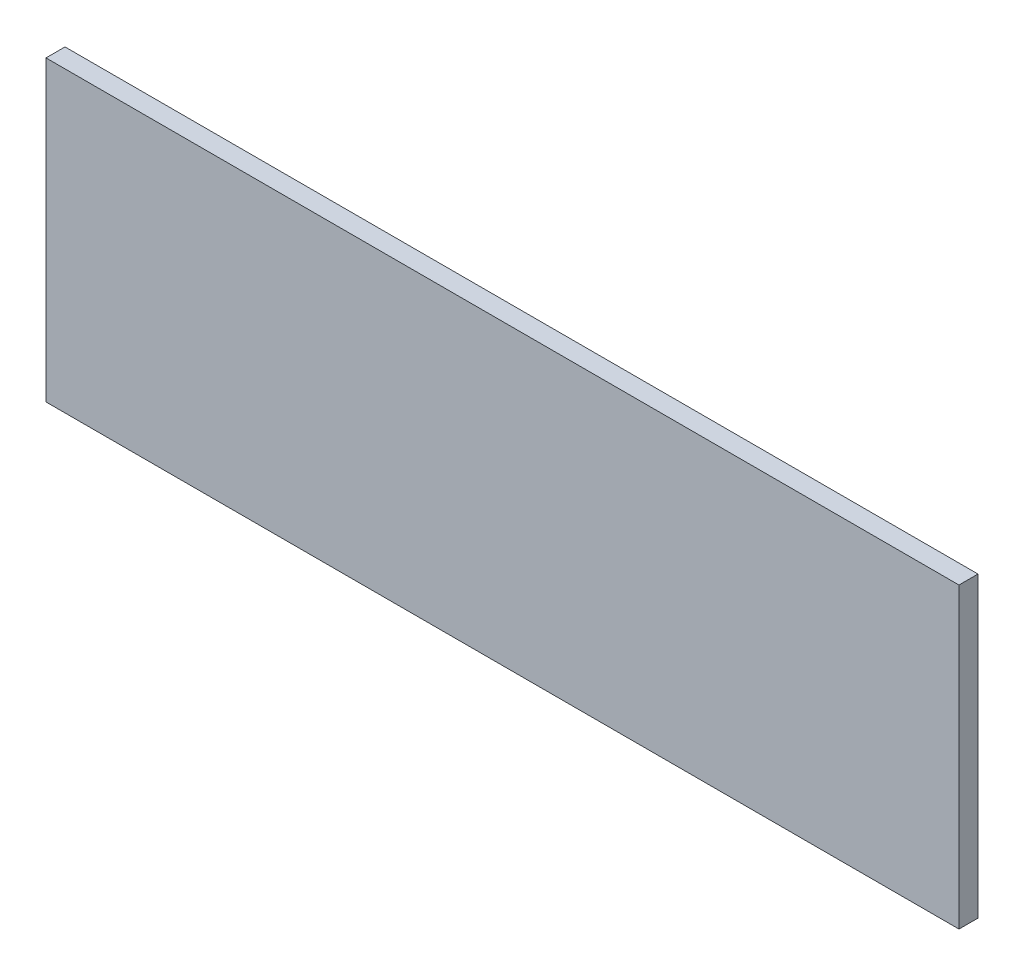
ISO-10303-21;
HEADER;
FILE_DESCRIPTION(('STEP AP214'),'2;1');
FILE_NAME('part.step','',(''),(''),'','','');
FILE_SCHEMA(('AUTOMOTIVE_DESIGN { 1 0 10303 214 1 1 1 1 }'));
ENDSEC;
DATA;
#1=APPLICATION_CONTEXT('core data for automotive mechanical design processes');
#2=APPLICATION_PROTOCOL_DEFINITION('international standard','automotive_design',2000,#1);
#3=PRODUCT_CONTEXT('',#1,'mechanical');
#4=PRODUCT('Part','Part','',(#3));
#5=PRODUCT_RELATED_PRODUCT_CATEGORY('part','',(#4));
#6=PRODUCT_DEFINITION_FORMATION('','',#4);
#7=PRODUCT_DEFINITION_CONTEXT('part definition',#1,'design');
#8=PRODUCT_DEFINITION('design','',#6,#7);
#9=PRODUCT_DEFINITION_SHAPE('','',#8);
#10=(LENGTH_UNIT() NAMED_UNIT(*) SI_UNIT(.MILLI.,.METRE.));
#11=(NAMED_UNIT(*) PLANE_ANGLE_UNIT() SI_UNIT($,.RADIAN.));
#12=(NAMED_UNIT(*) SI_UNIT($,.STERADIAN.) SOLID_ANGLE_UNIT());
#13=UNCERTAINTY_MEASURE_WITH_UNIT(LENGTH_MEASURE(1.E-05),#10,'distance_accuracy_value','');
#14=(GEOMETRIC_REPRESENTATION_CONTEXT(3) GLOBAL_UNCERTAINTY_ASSIGNED_CONTEXT((#13)) GLOBAL_UNIT_ASSIGNED_CONTEXT((#10,
#11,#12)) REPRESENTATION_CONTEXT('',''));
#15=CARTESIAN_POINT('',(0.,0.,0.));
#16=DIRECTION('',(0.,0.,1.));
#17=DIRECTION('',(1.,0.,0.));
#18=AXIS2_PLACEMENT_3D('',#15,#16,#17);
#19=CARTESIAN_POINT('',(159.64431366117,196.181377025538,3.));
#20=DIRECTION('',(0.,-1.,0.));
#21=DIRECTION('',(1.,0.,0.));
#22=AXIS2_PLACEMENT_3D('',#19,#20,#21);
#23=PLANE('',#22);
#24=DIRECTION('',(-1.,0.,0.));
#25=VECTOR('',#24,1.);
#26=CARTESIAN_POINT('',(159.64431366117,196.181377025538,0.));
#27=LINE('',#26,#25);
#28=CARTESIAN_POINT('',(159.64431366117,196.181377025538,0.));
#29=VERTEX_POINT('',#28);
#30=CARTESIAN_POINT('',(15.6443136611697,196.181377025538,0.));
#31=VERTEX_POINT('',#30);
#32=EDGE_CURVE('E97',#29,#31,#27,.T.);
#33=ORIENTED_EDGE('',*,*,#32,.F.);
#34=DIRECTION('',(0.,0.,-1.));
#35=VECTOR('',#34,1.);
#36=CARTESIAN_POINT('',(159.64431366117,196.181377025538,3.));
#37=LINE('',#36,#35);
#38=CARTESIAN_POINT('',(159.64431366117,196.181377025538,3.));
#39=VERTEX_POINT('',#38);
#40=EDGE_CURVE('E11',#39,#29,#37,.T.);
#41=ORIENTED_EDGE('',*,*,#40,.F.);
#42=DIRECTION('',(-1.,0.,0.));
#43=VECTOR('',#42,1.);
#44=CARTESIAN_POINT('',(159.64431366117,196.181377025538,3.));
#45=LINE('',#44,#43);
#46=CARTESIAN_POINT('',(15.6443136611697,196.181377025538,3.));
#47=VERTEX_POINT('',#46);
#48=EDGE_CURVE('E91',#39,#47,#45,.T.);
#49=ORIENTED_EDGE('',*,*,#48,.T.);
#50=DIRECTION('',(0.,0.,-1.));
#51=VECTOR('',#50,1.);
#52=CARTESIAN_POINT('',(15.6443136611697,196.181377025538,3.));
#53=LINE('',#52,#51);
#54=EDGE_CURVE('E36',#47,#31,#53,.T.);
#55=ORIENTED_EDGE('',*,*,#54,.T.);
#56=EDGE_LOOP('',(#33,#41,#49,#55));
#57=FACE_BOUND('',#56,.T.);
#58=ADVANCED_FACE('F33',(#57),#23,.T.);
#59=CARTESIAN_POINT('',(159.64431366117,243.181377025538,3.));
#60=DIRECTION('',(1.,0.,0.));
#61=DIRECTION('',(0.,0.,-1.));
#62=AXIS2_PLACEMENT_3D('',#59,#60,#61);
#63=PLANE('',#62);
#64=DIRECTION('',(0.,-1.,0.));
#65=VECTOR('',#64,1.);
#66=CARTESIAN_POINT('',(159.64431366117,243.181377025538,0.));
#67=LINE('',#66,#65);
#68=CARTESIAN_POINT('',(159.64431366117,243.181377025538,0.));
#69=VERTEX_POINT('',#68);
#70=EDGE_CURVE('E93',#69,#29,#67,.T.);
#71=ORIENTED_EDGE('',*,*,#70,.F.);
#72=DIRECTION('',(0.,0.,-1.));
#73=VECTOR('',#72,1.);
#74=CARTESIAN_POINT('',(159.64431366117,243.181377025538,3.));
#75=LINE('',#74,#73);
#76=CARTESIAN_POINT('',(159.64431366117,243.181377025538,3.));
#77=VERTEX_POINT('',#76);
#78=EDGE_CURVE('E42',#77,#69,#75,.T.);
#79=ORIENTED_EDGE('',*,*,#78,.F.);
#80=DIRECTION('',(0.,-1.,0.));
#81=VECTOR('',#80,1.);
#82=CARTESIAN_POINT('',(159.64431366117,243.181377025538,3.));
#83=LINE('',#82,#81);
#84=EDGE_CURVE('E88',#77,#39,#83,.T.);
#85=ORIENTED_EDGE('',*,*,#84,.T.);
#86=ORIENTED_EDGE('',*,*,#40,.T.);
#87=EDGE_LOOP('',(#71,#79,#85,#86));
#88=FACE_BOUND('',#87,.T.);
#89=ADVANCED_FACE('F107',(#88),#63,.T.);
#90=CARTESIAN_POINT('',(15.6443136611697,243.181377025538,3.));
#91=DIRECTION('',(0.,1.,0.));
#92=DIRECTION('',(0.,0.,1.));
#93=AXIS2_PLACEMENT_3D('',#90,#91,#92);
#94=PLANE('',#93);
#95=DIRECTION('',(1.,0.,0.));
#96=VECTOR('',#95,1.);
#97=CARTESIAN_POINT('',(15.6443136611697,243.181377025538,0.));
#98=LINE('',#97,#96);
#99=CARTESIAN_POINT('',(15.6443136611697,243.181377025538,0.));
#100=VERTEX_POINT('',#99);
#101=EDGE_CURVE('E83',#100,#69,#98,.T.);
#102=ORIENTED_EDGE('',*,*,#101,.F.);
#103=DIRECTION('',(0.,0.,-1.));
#104=VECTOR('',#103,1.);
#105=CARTESIAN_POINT('',(15.6443136611697,243.181377025538,3.));
#106=LINE('',#105,#104);
#107=CARTESIAN_POINT('',(15.6443136611697,243.181377025538,3.));
#108=VERTEX_POINT('',#107);
#109=EDGE_CURVE('E78',#108,#100,#106,.T.);
#110=ORIENTED_EDGE('',*,*,#109,.F.);
#111=DIRECTION('',(1.,0.,0.));
#112=VECTOR('',#111,1.);
#113=CARTESIAN_POINT('',(15.6443136611697,243.181377025538,3.));
#114=LINE('',#113,#112);
#115=EDGE_CURVE('E81',#108,#77,#114,.T.);
#116=ORIENTED_EDGE('',*,*,#115,.T.);
#117=ORIENTED_EDGE('',*,*,#78,.T.);
#118=EDGE_LOOP('',(#102,#110,#116,#117));
#119=FACE_BOUND('',#118,.T.);
#120=ADVANCED_FACE('F80',(#119),#94,.T.);
#121=CARTESIAN_POINT('',(15.6443136611697,196.181377025538,3.));
#122=DIRECTION('',(-1.,0.,0.));
#123=DIRECTION('',(0.,0.,1.));
#124=AXIS2_PLACEMENT_3D('',#121,#122,#123);
#125=PLANE('',#124);
#126=DIRECTION('',(0.,1.,0.));
#127=VECTOR('',#126,1.);
#128=CARTESIAN_POINT('',(15.6443136611697,196.181377025538,0.));
#129=LINE('',#128,#127);
#130=EDGE_CURVE('E100',#31,#100,#129,.T.);
#131=ORIENTED_EDGE('',*,*,#130,.F.);
#132=ORIENTED_EDGE('',*,*,#54,.F.);
#133=DIRECTION('',(0.,1.,0.));
#134=VECTOR('',#133,1.);
#135=CARTESIAN_POINT('',(15.6443136611697,196.181377025538,3.));
#136=LINE('',#135,#134);
#137=EDGE_CURVE('E87',#47,#108,#136,.T.);
#138=ORIENTED_EDGE('',*,*,#137,.T.);
#139=ORIENTED_EDGE('',*,*,#109,.T.);
#140=EDGE_LOOP('',(#131,#132,#138,#139));
#141=FACE_BOUND('',#140,.T.);
#142=ADVANCED_FACE('F90',(#141),#125,.T.);
#143=CARTESIAN_POINT('',(0.,0.,3.));
#144=DIRECTION('',(0.,0.,-1.));
#145=DIRECTION('',(-1.,0.,0.));
#146=AXIS2_PLACEMENT_3D('',#143,#144,#145);
#147=PLANE('',#146);
#148=ORIENTED_EDGE('',*,*,#48,.F.);
#149=ORIENTED_EDGE('',*,*,#84,.F.);
#150=ORIENTED_EDGE('',*,*,#115,.F.);
#151=ORIENTED_EDGE('',*,*,#137,.F.);
#152=EDGE_LOOP('',(#148,#149,#150,#151));
#153=FACE_BOUND('',#152,.T.);
#154=ADVANCED_FACE('F86',(#153),#147,.F.);
#155=CARTESIAN_POINT('',(0.,0.,0.));
#156=DIRECTION('',(0.,0.,-1.));
#157=DIRECTION('',(-1.,0.,0.));
#158=AXIS2_PLACEMENT_3D('',#155,#156,#157);
#159=PLANE('',#158);
#160=ORIENTED_EDGE('',*,*,#32,.T.);
#161=ORIENTED_EDGE('',*,*,#130,.T.);
#162=ORIENTED_EDGE('',*,*,#101,.T.);
#163=ORIENTED_EDGE('',*,*,#70,.T.);
#164=EDGE_LOOP('',(#160,#161,#162,#163));
#165=FACE_BOUND('',#164,.T.);
#166=ADVANCED_FACE('F106',(#165),#159,.T.);
#167=CLOSED_SHELL('',(#58,#89,#120,#142,#154,#166));
#168=MANIFOLD_SOLID_BREP('B2',#167);
#169=ADVANCED_BREP_SHAPE_REPRESENTATION('',(#18,#168),#14);
#170=SHAPE_DEFINITION_REPRESENTATION(#9,#169);
ENDSEC;
END-ISO-10303-21;
